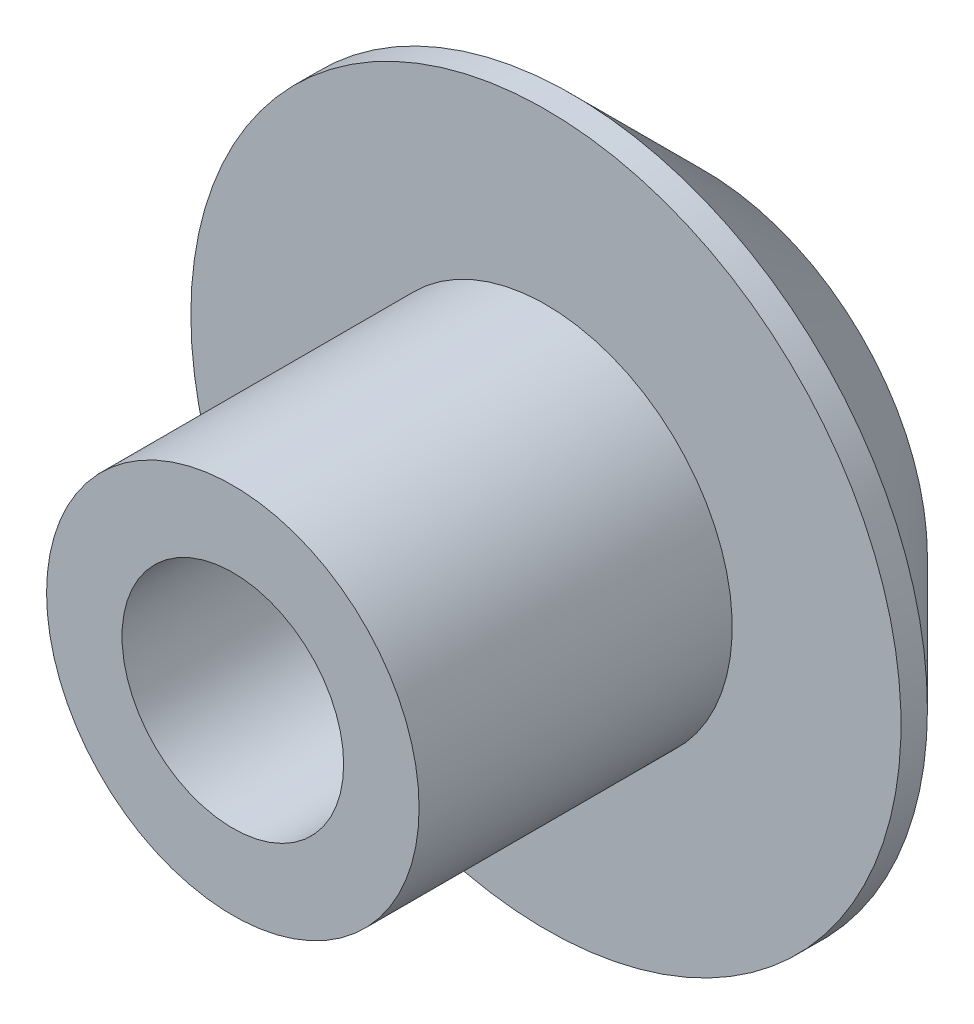
ISO-10303-21;
HEADER;
FILE_DESCRIPTION(('STEP AP214'),'2;1');
FILE_NAME('part.step','',(''),(''),'','','');
FILE_SCHEMA(('AUTOMOTIVE_DESIGN { 1 0 10303 214 1 1 1 1 }'));
ENDSEC;
DATA;
#1=APPLICATION_CONTEXT('core data for automotive mechanical design processes');
#2=APPLICATION_PROTOCOL_DEFINITION('international standard','automotive_design',2000,#1);
#3=PRODUCT_CONTEXT('',#1,'mechanical');
#4=PRODUCT('Part','Part','',(#3));
#5=PRODUCT_RELATED_PRODUCT_CATEGORY('part','',(#4));
#6=PRODUCT_DEFINITION_FORMATION('','',#4);
#7=PRODUCT_DEFINITION_CONTEXT('part definition',#1,'design');
#8=PRODUCT_DEFINITION('design','',#6,#7);
#9=PRODUCT_DEFINITION_SHAPE('','',#8);
#10=(LENGTH_UNIT() NAMED_UNIT(*) SI_UNIT(.MILLI.,.METRE.));
#11=(NAMED_UNIT(*) PLANE_ANGLE_UNIT() SI_UNIT($,.RADIAN.));
#12=(NAMED_UNIT(*) SI_UNIT($,.STERADIAN.) SOLID_ANGLE_UNIT());
#13=UNCERTAINTY_MEASURE_WITH_UNIT(LENGTH_MEASURE(1.E-05),#10,'distance_accuracy_value','');
#14=(GEOMETRIC_REPRESENTATION_CONTEXT(3) GLOBAL_UNCERTAINTY_ASSIGNED_CONTEXT((#13)) GLOBAL_UNIT_ASSIGNED_CONTEXT((#10,
#11,#12)) REPRESENTATION_CONTEXT('',''));
#15=CARTESIAN_POINT('',(0.,0.,0.));
#16=DIRECTION('',(0.,0.,1.));
#17=DIRECTION('',(1.,0.,0.));
#18=AXIS2_PLACEMENT_3D('',#15,#16,#17);
#19=CARTESIAN_POINT('',(0.,0.,5.));
#20=DIRECTION('',(0.,0.,-1.));
#21=DIRECTION('',(-1.,0.,0.));
#22=AXIS2_PLACEMENT_3D('',#19,#20,#21);
#23=CYLINDRICAL_SURFACE('',#22,1.975);
#24=CARTESIAN_POINT('',(0.,0.,5.));
#25=DIRECTION('',(0.,0.,1.));
#26=DIRECTION('',(1.,0.,0.));
#27=AXIS2_PLACEMENT_3D('',#24,#25,#26);
#28=CIRCLE('',#27,1.975);
#29=CARTESIAN_POINT('',(1.975,0.,5.));
#30=VERTEX_POINT('',#29);
#31=EDGE_CURVE('E49',#30,#30,#28,.T.);
#32=ORIENTED_EDGE('',*,*,#31,.F.);
#33=EDGE_LOOP('',(#32));
#34=FACE_BOUND('',#33,.T.);
#35=CARTESIAN_POINT('',(0.,0.,1.68));
#36=DIRECTION('',(0.,0.,-1.));
#37=DIRECTION('',(-1.,0.,0.));
#38=AXIS2_PLACEMENT_3D('',#35,#36,#37);
#39=CIRCLE('',#38,1.975);
#40=CARTESIAN_POINT('',(-1.975,0.,1.68));
#41=VERTEX_POINT('',#40);
#42=EDGE_CURVE('E45',#41,#41,#39,.T.);
#43=ORIENTED_EDGE('',*,*,#42,.F.);
#44=EDGE_LOOP('',(#43));
#45=FACE_BOUND('',#44,.T.);
#46=ADVANCED_FACE('F33',(#34,#45),#23,.T.);
#47=CARTESIAN_POINT('',(0.,0.,5.));
#48=DIRECTION('',(0.,0.,1.));
#49=DIRECTION('',(1.,0.,0.));
#50=AXIS2_PLACEMENT_3D('',#47,#48,#49);
#51=PLANE('',#50);
#52=ORIENTED_EDGE('',*,*,#31,.T.);
#53=EDGE_LOOP('',(#52));
#54=FACE_BOUND('',#53,.T.);
#55=CARTESIAN_POINT('',(0.,0.,5.));
#56=DIRECTION('',(0.,0.,1.));
#57=DIRECTION('',(1.,0.,0.));
#58=AXIS2_PLACEMENT_3D('',#55,#56,#57);
#59=CIRCLE('',#58,1.175);
#60=CARTESIAN_POINT('',(1.175,0.,5.));
#61=VERTEX_POINT('',#60);
#62=EDGE_CURVE('E54',#61,#61,#59,.T.);
#63=ORIENTED_EDGE('',*,*,#62,.F.);
#64=EDGE_LOOP('',(#63));
#65=FACE_BOUND('',#64,.T.);
#66=ADVANCED_FACE('F74',(#54,#65),#51,.T.);
#67=CARTESIAN_POINT('',(0.,0.,0.));
#68=DIRECTION('',(0.,0.,1.));
#69=DIRECTION('',(1.,0.,0.));
#70=AXIS2_PLACEMENT_3D('',#67,#68,#69);
#71=PLANE('',#70);
#72=CARTESIAN_POINT('',(0.,0.,0.));
#73=DIRECTION('',(0.,0.,1.));
#74=DIRECTION('',(1.,0.,0.));
#75=AXIS2_PLACEMENT_3D('',#72,#73,#74);
#76=CIRCLE('',#75,2.365);
#77=CARTESIAN_POINT('',(2.365,0.,0.));
#78=VERTEX_POINT('',#77);
#79=EDGE_CURVE('E41',#78,#78,#76,.F.);
#80=ORIENTED_EDGE('',*,*,#79,.T.);
#81=EDGE_LOOP('',(#80));
#82=FACE_BOUND('',#81,.T.);
#83=CARTESIAN_POINT('',(0.,0.,0.));
#84=DIRECTION('',(0.,0.,1.));
#85=DIRECTION('',(1.,0.,0.));
#86=AXIS2_PLACEMENT_3D('',#83,#84,#85);
#87=CIRCLE('',#86,1.175);
#88=CARTESIAN_POINT('',(1.175,0.,0.));
#89=VERTEX_POINT('',#88);
#90=EDGE_CURVE('E55',#89,#89,#87,.T.);
#91=ORIENTED_EDGE('',*,*,#90,.T.);
#92=EDGE_LOOP('',(#91));
#93=FACE_BOUND('',#92,.T.);
#94=ADVANCED_FACE('F79',(#82,#93),#71,.F.);
#95=CARTESIAN_POINT('',(0.,0.,5.));
#96=DIRECTION('',(0.,0.,-1.));
#97=DIRECTION('',(-1.,0.,0.));
#98=AXIS2_PLACEMENT_3D('',#95,#96,#97);
#99=CYLINDRICAL_SURFACE('',#98,1.175);
#100=ORIENTED_EDGE('',*,*,#90,.F.);
#101=EDGE_LOOP('',(#100));
#102=FACE_BOUND('',#101,.T.);
#103=ORIENTED_EDGE('',*,*,#62,.T.);
#104=EDGE_LOOP('',(#103));
#105=FACE_BOUND('',#104,.T.);
#106=ADVANCED_FACE('F69',(#102,#105),#99,.F.);
#107=CARTESIAN_POINT('',(0.,0.,1.68));
#108=DIRECTION('',(0.,0.,-1.));
#109=DIRECTION('',(-1.,0.,0.));
#110=AXIS2_PLACEMENT_3D('',#107,#108,#109);
#111=PLANE('',#110);
#112=CARTESIAN_POINT('',(0.,0.,1.68));
#113=DIRECTION('',(0.,0.,-1.));
#114=DIRECTION('',(-1.,0.,0.));
#115=AXIS2_PLACEMENT_3D('',#112,#113,#114);
#116=CIRCLE('',#115,3.765);
#117=CARTESIAN_POINT('',(-3.765,0.,1.68));
#118=VERTEX_POINT('',#117);
#119=EDGE_CURVE('E58',#118,#118,#116,.T.);
#120=ORIENTED_EDGE('',*,*,#119,.F.);
#121=EDGE_LOOP('',(#120));
#122=FACE_BOUND('',#121,.T.);
#123=ORIENTED_EDGE('',*,*,#42,.T.);
#124=EDGE_LOOP('',(#123));
#125=FACE_BOUND('',#124,.T.);
#126=ADVANCED_FACE('F66',(#122,#125),#111,.F.);
#127=CARTESIAN_POINT('',(0.,0.,1.68));
#128=DIRECTION('',(0.,0.,-1.));
#129=DIRECTION('',(-1.,0.,0.));
#130=AXIS2_PLACEMENT_3D('',#127,#128,#129);
#131=CYLINDRICAL_SURFACE('',#130,3.765);
#132=CARTESIAN_POINT('',(0.,0.,1.40000000000001));
#133=DIRECTION('',(0.,0.,1.));
#134=DIRECTION('',(1.,0.,0.));
#135=AXIS2_PLACEMENT_3D('',#132,#133,#134);
#136=CIRCLE('',#135,3.765);
#137=CARTESIAN_POINT('',(3.765,0.,1.40000000000001));
#138=VERTEX_POINT('',#137);
#139=EDGE_CURVE('E10',#138,#138,#136,.T.);
#140=ORIENTED_EDGE('',*,*,#139,.T.);
#141=EDGE_LOOP('',(#140));
#142=FACE_BOUND('',#141,.T.);
#143=ORIENTED_EDGE('',*,*,#119,.T.);
#144=EDGE_LOOP('',(#143));
#145=FACE_BOUND('',#144,.T.);
#146=ADVANCED_FACE('F64',(#142,#145),#131,.T.);
#147=CARTESIAN_POINT('',(0.,0.,0.));
#148=DIRECTION('',(0.,0.,1.));
#149=DIRECTION('',(1.,0.,0.));
#150=AXIS2_PLACEMENT_3D('',#147,#148,#149);
#151=CONICAL_SURFACE('',#150,2.365,0.785398163397446);
#152=ORIENTED_EDGE('',*,*,#139,.F.);
#153=EDGE_LOOP('',(#152));
#154=FACE_BOUND('',#153,.T.);
#155=ORIENTED_EDGE('',*,*,#79,.F.);
#156=EDGE_LOOP('',(#155));
#157=FACE_BOUND('',#156,.T.);
#158=ADVANCED_FACE('F36',(#154,#157),#151,.T.);
#159=CLOSED_SHELL('',(#46,#66,#94,#106,#126,#146,#158));
#160=MANIFOLD_SOLID_BREP('B2',#159);
#161=ADVANCED_BREP_SHAPE_REPRESENTATION('',(#18,#160),#14);
#162=SHAPE_DEFINITION_REPRESENTATION(#9,#161);
ENDSEC;
END-ISO-10303-21;
